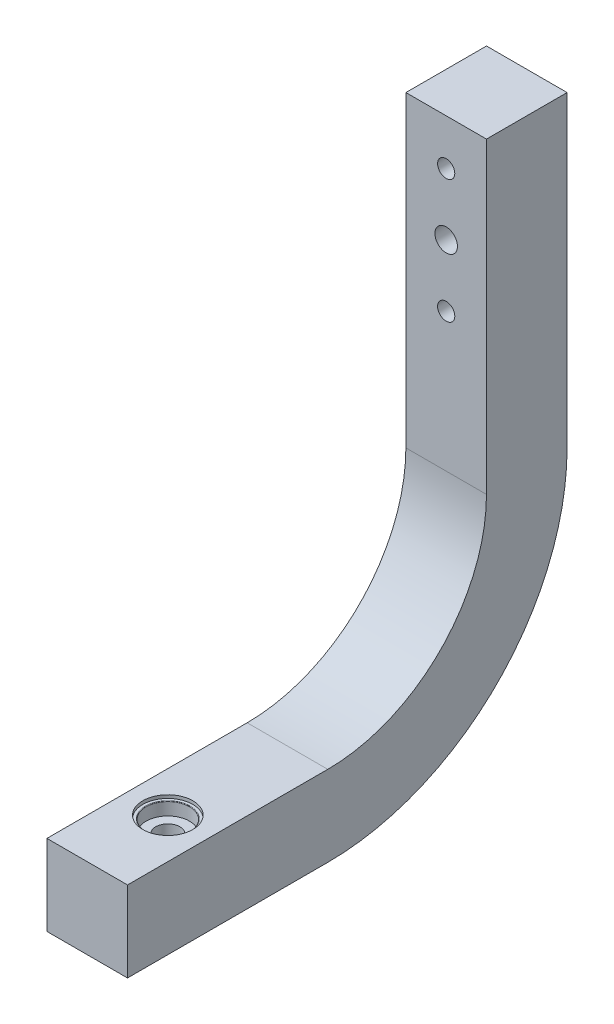
ISO-10303-21;
HEADER;
FILE_DESCRIPTION(('STEP AP214'),'2;1');
FILE_NAME('part.step','',(''),(''),'','','');
FILE_SCHEMA(('AUTOMOTIVE_DESIGN { 1 0 10303 214 1 1 1 1 }'));
ENDSEC;
DATA;
#1=APPLICATION_CONTEXT('core data for automotive mechanical design processes');
#2=APPLICATION_PROTOCOL_DEFINITION('international standard','automotive_design',2000,#1);
#3=PRODUCT_CONTEXT('',#1,'mechanical');
#4=PRODUCT('Part','Part','',(#3));
#5=PRODUCT_RELATED_PRODUCT_CATEGORY('part','',(#4));
#6=PRODUCT_DEFINITION_FORMATION('','',#4);
#7=PRODUCT_DEFINITION_CONTEXT('part definition',#1,'design');
#8=PRODUCT_DEFINITION('design','',#6,#7);
#9=PRODUCT_DEFINITION_SHAPE('','',#8);
#10=(LENGTH_UNIT() NAMED_UNIT(*) SI_UNIT(.MILLI.,.METRE.));
#11=(NAMED_UNIT(*) PLANE_ANGLE_UNIT() SI_UNIT($,.RADIAN.));
#12=(NAMED_UNIT(*) SI_UNIT($,.STERADIAN.) SOLID_ANGLE_UNIT());
#13=UNCERTAINTY_MEASURE_WITH_UNIT(LENGTH_MEASURE(1.E-05),#10,'distance_accuracy_value','');
#14=(GEOMETRIC_REPRESENTATION_CONTEXT(3) GLOBAL_UNCERTAINTY_ASSIGNED_CONTEXT((#13)) GLOBAL_UNIT_ASSIGNED_CONTEXT((#10,
#11,#12)) REPRESENTATION_CONTEXT('',''));
#15=CARTESIAN_POINT('',(0.,0.,0.));
#16=DIRECTION('',(0.,0.,1.));
#17=DIRECTION('',(1.,0.,0.));
#18=AXIS2_PLACEMENT_3D('',#15,#16,#17);
#19=CARTESIAN_POINT('',(-7.5,-37.2681938200001,15.));
#20=DIRECTION('',(0.,0.,1.));
#21=DIRECTION('',(0.,-1.,0.));
#22=AXIS2_PLACEMENT_3D('',#19,#20,#21);
#23=PLANE('',#22);
#24=CARTESIAN_POINT('',(0.,-11.5,15.));
#25=DIRECTION('',(0.,0.,1.));
#26=DIRECTION('',(0.,-1.,0.));
#27=AXIS2_PLACEMENT_3D('',#24,#25,#26);
#28=CIRCLE('',#27,1.6);
#29=CARTESIAN_POINT('',(0.,-13.1,15.));
#30=VERTEX_POINT('',#29);
#31=EDGE_CURVE('E123',#30,#30,#28,.T.);
#32=ORIENTED_EDGE('',*,*,#31,.F.);
#33=EDGE_LOOP('',(#32));
#34=FACE_BOUND('',#33,.T.);
#35=CARTESIAN_POINT('',(0.,11.5,15.));
#36=DIRECTION('',(0.,0.,1.));
#37=DIRECTION('',(0.,-1.,0.));
#38=AXIS2_PLACEMENT_3D('',#35,#36,#37);
#39=CIRCLE('',#38,1.6);
#40=CARTESIAN_POINT('',(0.,9.90000000000001,15.));
#41=VERTEX_POINT('',#40);
#42=EDGE_CURVE('E126',#41,#41,#39,.T.);
#43=ORIENTED_EDGE('',*,*,#42,.F.);
#44=EDGE_LOOP('',(#43));
#45=FACE_BOUND('',#44,.T.);
#46=CARTESIAN_POINT('',(0.,0.,15.));
#47=DIRECTION('',(0.,0.,1.));
#48=DIRECTION('',(0.,-1.,0.));
#49=AXIS2_PLACEMENT_3D('',#46,#47,#48);
#50=CIRCLE('',#49,2.1);
#51=CARTESIAN_POINT('',(0.,-2.09999999999999,15.));
#52=VERTEX_POINT('',#51);
#53=EDGE_CURVE('E209',#52,#52,#50,.T.);
#54=ORIENTED_EDGE('',*,*,#53,.F.);
#55=EDGE_LOOP('',(#54));
#56=FACE_BOUND('',#55,.T.);
#57=DIRECTION('',(1.,0.,0.));
#58=VECTOR('',#57,1.);
#59=CARTESIAN_POINT('',(-7.5,-37.26819382,15.));
#60=LINE('',#59,#58);
#61=CARTESIAN_POINT('',(-7.5,-37.26819382,15.));
#62=VERTEX_POINT('',#61);
#63=CARTESIAN_POINT('',(7.5,-37.26819382,15.));
#64=VERTEX_POINT('',#63);
#65=EDGE_CURVE('E100',#62,#64,#60,.T.);
#66=ORIENTED_EDGE('',*,*,#65,.T.);
#67=DIRECTION('',(0.,-1.,0.));
#68=VECTOR('',#67,1.);
#69=CARTESIAN_POINT('',(7.5,-37.2681938200001,15.));
#70=LINE('',#69,#68);
#71=CARTESIAN_POINT('',(7.5,20.,15.));
#72=VERTEX_POINT('',#71);
#73=EDGE_CURVE('E103',#72,#64,#70,.T.);
#74=ORIENTED_EDGE('',*,*,#73,.F.);
#75=DIRECTION('',(1.,0.,0.));
#76=VECTOR('',#75,1.);
#77=CARTESIAN_POINT('',(-7.5,20.,15.));
#78=LINE('',#77,#76);
#79=CARTESIAN_POINT('',(-7.5,20.,15.));
#80=VERTEX_POINT('',#79);
#81=EDGE_CURVE('E11',#80,#72,#78,.T.);
#82=ORIENTED_EDGE('',*,*,#81,.F.);
#83=DIRECTION('',(0.,-1.,0.));
#84=VECTOR('',#83,1.);
#85=CARTESIAN_POINT('',(-7.5,-37.2681938200001,15.));
#86=LINE('',#85,#84);
#87=EDGE_CURVE('E104',#80,#62,#86,.T.);
#88=ORIENTED_EDGE('',*,*,#87,.T.);
#89=EDGE_LOOP('',(#66,#74,#82,#88));
#90=FACE_BOUND('',#89,.T.);
#91=ADVANCED_FACE('F38',(#34,#45,#56,#90),#23,.T.);
#92=CARTESIAN_POINT('',(-7.5,20.,15.));
#93=DIRECTION('',(0.,1.,0.));
#94=DIRECTION('',(0.,0.,1.));
#95=AXIS2_PLACEMENT_3D('',#92,#93,#94);
#96=PLANE('',#95);
#97=ORIENTED_EDGE('',*,*,#81,.T.);
#98=DIRECTION('',(0.,0.,1.));
#99=VECTOR('',#98,1.);
#100=CARTESIAN_POINT('',(7.5,20.,15.));
#101=LINE('',#100,#99);
#102=CARTESIAN_POINT('',(7.5,20.,0.));
#103=VERTEX_POINT('',#102);
#104=EDGE_CURVE('E122',#103,#72,#101,.T.);
#105=ORIENTED_EDGE('',*,*,#104,.F.);
#106=DIRECTION('',(1.,0.,0.));
#107=VECTOR('',#106,1.);
#108=CARTESIAN_POINT('',(-7.5,20.,0.));
#109=LINE('',#108,#107);
#110=CARTESIAN_POINT('',(-7.5,20.,0.));
#111=VERTEX_POINT('',#110);
#112=EDGE_CURVE('E46',#111,#103,#109,.T.);
#113=ORIENTED_EDGE('',*,*,#112,.F.);
#114=DIRECTION('',(0.,0.,1.));
#115=VECTOR('',#114,1.);
#116=CARTESIAN_POINT('',(-7.5,20.,15.));
#117=LINE('',#116,#115);
#118=EDGE_CURVE('E109',#111,#80,#117,.T.);
#119=ORIENTED_EDGE('',*,*,#118,.T.);
#120=EDGE_LOOP('',(#97,#105,#113,#119));
#121=FACE_BOUND('',#120,.T.);
#122=ADVANCED_FACE('F219',(#121),#96,.T.);
#123=CARTESIAN_POINT('',(-7.5,20.,0.));
#124=DIRECTION('',(0.,0.,-1.));
#125=DIRECTION('',(0.,1.,0.));
#126=AXIS2_PLACEMENT_3D('',#123,#124,#125);
#127=PLANE('',#126);
#128=CARTESIAN_POINT('',(0.,-11.5,0.));
#129=DIRECTION('',(0.,0.,1.));
#130=DIRECTION('',(1.,0.,0.));
#131=AXIS2_PLACEMENT_3D('',#128,#129,#130);
#132=CIRCLE('',#131,1.6);
#133=CARTESIAN_POINT('',(1.6,-11.5,0.));
#134=VERTEX_POINT('',#133);
#135=EDGE_CURVE('E174',#134,#134,#132,.T.);
#136=ORIENTED_EDGE('',*,*,#135,.T.);
#137=EDGE_LOOP('',(#136));
#138=FACE_BOUND('',#137,.T.);
#139=CARTESIAN_POINT('',(0.,11.5,0.));
#140=DIRECTION('',(0.,0.,1.));
#141=DIRECTION('',(1.,0.,0.));
#142=AXIS2_PLACEMENT_3D('',#139,#140,#141);
#143=CIRCLE('',#142,1.6);
#144=CARTESIAN_POINT('',(1.6,11.5,0.));
#145=VERTEX_POINT('',#144);
#146=EDGE_CURVE('E201',#145,#145,#143,.T.);
#147=ORIENTED_EDGE('',*,*,#146,.T.);
#148=EDGE_LOOP('',(#147));
#149=FACE_BOUND('',#148,.T.);
#150=CARTESIAN_POINT('',(0.,0.,0.));
#151=DIRECTION('',(0.,0.,1.));
#152=DIRECTION('',(1.,0.,0.));
#153=AXIS2_PLACEMENT_3D('',#150,#151,#152);
#154=CIRCLE('',#153,2.1);
#155=CARTESIAN_POINT('',(2.1,0.,0.));
#156=VERTEX_POINT('',#155);
#157=EDGE_CURVE('E204',#156,#156,#154,.T.);
#158=ORIENTED_EDGE('',*,*,#157,.T.);
#159=EDGE_LOOP('',(#158));
#160=FACE_BOUND('',#159,.T.);
#161=ORIENTED_EDGE('',*,*,#112,.T.);
#162=DIRECTION('',(0.,1.,0.));
#163=VECTOR('',#162,1.);
#164=CARTESIAN_POINT('',(7.5,20.,0.));
#165=LINE('',#164,#163);
#166=CARTESIAN_POINT('',(7.5,-37.26819382,0.));
#167=VERTEX_POINT('',#166);
#168=EDGE_CURVE('E140',#167,#103,#165,.T.);
#169=ORIENTED_EDGE('',*,*,#168,.F.);
#170=DIRECTION('',(1.,0.,0.));
#171=VECTOR('',#170,1.);
#172=CARTESIAN_POINT('',(-7.5,-37.26819382,0.));
#173=LINE('',#172,#171);
#174=CARTESIAN_POINT('',(-7.5,-37.26819382,0.));
#175=VERTEX_POINT('',#174);
#176=EDGE_CURVE('E160',#175,#167,#173,.T.);
#177=ORIENTED_EDGE('',*,*,#176,.F.);
#178=DIRECTION('',(0.,1.,0.));
#179=VECTOR('',#178,1.);
#180=CARTESIAN_POINT('',(-7.5,20.,0.));
#181=LINE('',#180,#179);
#182=EDGE_CURVE('E156',#175,#111,#181,.T.);
#183=ORIENTED_EDGE('',*,*,#182,.T.);
#184=EDGE_LOOP('',(#161,#169,#177,#183));
#185=FACE_BOUND('',#184,.T.);
#186=ADVANCED_FACE('F229',(#138,#149,#160,#185),#127,.T.);
#187=CARTESIAN_POINT('',(-7.5,-37.26819382,44.53638764));
#188=DIRECTION('',(1.,0.,0.));
#189=DIRECTION('',(0.,0.,-1.));
#190=AXIS2_PLACEMENT_3D('',#187,#188,#189);
#191=CYLINDRICAL_SURFACE('',#190,44.53638764);
#192=ORIENTED_EDGE('',*,*,#176,.T.);
#193=CARTESIAN_POINT('',(7.5,-37.26819382,44.53638764));
#194=DIRECTION('',(1.,0.,0.));
#195=DIRECTION('',(0.,0.,-1.));
#196=AXIS2_PLACEMENT_3D('',#193,#194,#195);
#197=CIRCLE('',#196,44.53638764);
#198=CARTESIAN_POINT('',(7.5,-81.80458146,44.53638764));
#199=VERTEX_POINT('',#198);
#200=EDGE_CURVE('E137',#199,#167,#197,.T.);
#201=ORIENTED_EDGE('',*,*,#200,.F.);
#202=DIRECTION('',(1.,0.,0.));
#203=VECTOR('',#202,1.);
#204=CARTESIAN_POINT('',(-7.5,-81.80458146,44.53638764));
#205=LINE('',#204,#203);
#206=CARTESIAN_POINT('',(-7.5,-81.80458146,44.53638764));
#207=VERTEX_POINT('',#206);
#208=EDGE_CURVE('E162',#207,#199,#205,.T.);
#209=ORIENTED_EDGE('',*,*,#208,.F.);
#210=CARTESIAN_POINT('',(-7.5,-37.26819382,44.53638764));
#211=DIRECTION('',(1.,0.,0.));
#212=DIRECTION('',(0.,0.,-1.));
#213=AXIS2_PLACEMENT_3D('',#210,#211,#212);
#214=CIRCLE('',#213,44.53638764);
#215=EDGE_CURVE('E153',#207,#175,#214,.T.);
#216=ORIENTED_EDGE('',*,*,#215,.T.);
#217=EDGE_LOOP('',(#192,#201,#209,#216));
#218=FACE_BOUND('',#217,.T.);
#219=ADVANCED_FACE('F232',(#218),#191,.T.);
#220=CARTESIAN_POINT('',(-7.5,-81.80458146,44.53638764));
#221=DIRECTION('',(0.,-1.,0.));
#222=DIRECTION('',(0.,0.,-1.));
#223=AXIS2_PLACEMENT_3D('',#220,#221,#222);
#224=PLANE('',#223);
#225=CARTESIAN_POINT('',(0.,-81.80458146,66.80458146));
#226=DIRECTION('',(0.,-1.,0.));
#227=DIRECTION('',(0.,0.,-1.));
#228=AXIS2_PLACEMENT_3D('',#225,#226,#227);
#229=CIRCLE('',#228,4.65);
#230=CARTESIAN_POINT('',(0.,-81.80458146,62.15458146));
#231=VERTEX_POINT('',#230);
#232=EDGE_CURVE('E200',#231,#231,#229,.T.);
#233=ORIENTED_EDGE('',*,*,#232,.F.);
#234=EDGE_LOOP('',(#233));
#235=FACE_BOUND('',#234,.T.);
#236=ORIENTED_EDGE('',*,*,#208,.T.);
#237=DIRECTION('',(0.,0.,-1.));
#238=VECTOR('',#237,1.);
#239=CARTESIAN_POINT('',(7.5,-81.80458146,66.80458146));
#240=LINE('',#239,#238);
#241=CARTESIAN_POINT('',(7.5,-81.80458146,81.80458146));
#242=VERTEX_POINT('',#241);
#243=EDGE_CURVE('E134',#242,#199,#240,.T.);
#244=ORIENTED_EDGE('',*,*,#243,.F.);
#245=DIRECTION('',(1.,0.,0.));
#246=VECTOR('',#245,1.);
#247=CARTESIAN_POINT('',(-7.5,-81.80458146,81.80458146));
#248=LINE('',#247,#246);
#249=CARTESIAN_POINT('',(-7.5,-81.80458146,81.80458146));
#250=VERTEX_POINT('',#249);
#251=EDGE_CURVE('E164',#250,#242,#248,.T.);
#252=ORIENTED_EDGE('',*,*,#251,.F.);
#253=DIRECTION('',(0.,0.,-1.));
#254=VECTOR('',#253,1.);
#255=CARTESIAN_POINT('',(-7.5,-81.80458146,66.80458146));
#256=LINE('',#255,#254);
#257=EDGE_CURVE('E151',#250,#207,#256,.T.);
#258=ORIENTED_EDGE('',*,*,#257,.T.);
#259=EDGE_LOOP('',(#236,#244,#252,#258));
#260=FACE_BOUND('',#259,.T.);
#261=ADVANCED_FACE('F253',(#235,#260),#224,.T.);
#262=CARTESIAN_POINT('',(-7.5,-66.80458146,81.80458146));
#263=DIRECTION('',(0.,0.,1.));
#264=DIRECTION('',(1.,0.,0.));
#265=AXIS2_PLACEMENT_3D('',#262,#263,#264);
#266=PLANE('',#265);
#267=ORIENTED_EDGE('',*,*,#251,.T.);
#268=DIRECTION('',(0.,-1.,0.));
#269=VECTOR('',#268,1.);
#270=CARTESIAN_POINT('',(7.5,-66.80458146,81.80458146));
#271=LINE('',#270,#269);
#272=CARTESIAN_POINT('',(7.5,-66.80458146,81.80458146));
#273=VERTEX_POINT('',#272);
#274=EDGE_CURVE('E131',#273,#242,#271,.T.);
#275=ORIENTED_EDGE('',*,*,#274,.F.);
#276=DIRECTION('',(1.,0.,0.));
#277=VECTOR('',#276,1.);
#278=CARTESIAN_POINT('',(-7.5,-66.80458146,81.80458146));
#279=LINE('',#278,#277);
#280=CARTESIAN_POINT('',(-7.5,-66.80458146,81.80458146));
#281=VERTEX_POINT('',#280);
#282=EDGE_CURVE('E166',#281,#273,#279,.T.);
#283=ORIENTED_EDGE('',*,*,#282,.F.);
#284=DIRECTION('',(0.,-1.,0.));
#285=VECTOR('',#284,1.);
#286=CARTESIAN_POINT('',(-7.5,-66.80458146,81.80458146));
#287=LINE('',#286,#285);
#288=EDGE_CURVE('E148',#281,#250,#287,.T.);
#289=ORIENTED_EDGE('',*,*,#288,.T.);
#290=EDGE_LOOP('',(#267,#275,#283,#289));
#291=FACE_BOUND('',#290,.T.);
#292=ADVANCED_FACE('F250',(#291),#266,.T.);
#293=CARTESIAN_POINT('',(-7.5,-66.80458146,66.80458146));
#294=DIRECTION('',(0.,1.,0.));
#295=DIRECTION('',(0.,0.,1.));
#296=AXIS2_PLACEMENT_3D('',#293,#294,#295);
#297=PLANE('',#296);
#298=CARTESIAN_POINT('',(0.,-66.80458146,66.80458146));
#299=DIRECTION('',(0.,-1.,0.));
#300=DIRECTION('',(0.,0.,-1.));
#301=AXIS2_PLACEMENT_3D('',#298,#299,#300);
#302=CIRCLE('',#301,4.65);
#303=CARTESIAN_POINT('',(0.,-66.80458146,62.15458146));
#304=VERTEX_POINT('',#303);
#305=EDGE_CURVE('E197',#304,#304,#302,.T.);
#306=ORIENTED_EDGE('',*,*,#305,.T.);
#307=EDGE_LOOP('',(#306));
#308=FACE_BOUND('',#307,.T.);
#309=ORIENTED_EDGE('',*,*,#282,.T.);
#310=DIRECTION('',(0.,0.,1.));
#311=VECTOR('',#310,1.);
#312=CARTESIAN_POINT('',(7.5,-66.80458146,66.80458146));
#313=LINE('',#312,#311);
#314=CARTESIAN_POINT('',(7.5,-66.80458146,44.53638764));
#315=VERTEX_POINT('',#314);
#316=EDGE_CURVE('E117',#315,#273,#313,.T.);
#317=ORIENTED_EDGE('',*,*,#316,.F.);
#318=DIRECTION('',(1.,0.,0.));
#319=VECTOR('',#318,1.);
#320=CARTESIAN_POINT('',(-7.5,-66.80458146,44.53638764));
#321=LINE('',#320,#319);
#322=CARTESIAN_POINT('',(-7.5,-66.80458146,44.53638764));
#323=VERTEX_POINT('',#322);
#324=EDGE_CURVE('E108',#323,#315,#321,.T.);
#325=ORIENTED_EDGE('',*,*,#324,.F.);
#326=DIRECTION('',(0.,0.,1.));
#327=VECTOR('',#326,1.);
#328=CARTESIAN_POINT('',(-7.5,-66.80458146,66.80458146));
#329=LINE('',#328,#327);
#330=EDGE_CURVE('E146',#323,#281,#329,.T.);
#331=ORIENTED_EDGE('',*,*,#330,.T.);
#332=EDGE_LOOP('',(#309,#317,#325,#331));
#333=FACE_BOUND('',#332,.T.);
#334=ADVANCED_FACE('F247',(#308,#333),#297,.T.);
#335=CARTESIAN_POINT('',(-7.5,-37.26819382,44.53638764));
#336=DIRECTION('',(1.,0.,0.));
#337=DIRECTION('',(0.,0.,-1.));
#338=AXIS2_PLACEMENT_3D('',#335,#336,#337);
#339=CYLINDRICAL_SURFACE('',#338,29.53638764);
#340=ORIENTED_EDGE('',*,*,#324,.T.);
#341=CARTESIAN_POINT('',(7.5,-37.26819382,44.53638764));
#342=DIRECTION('',(-1.,0.,0.));
#343=DIRECTION('',(0.,0.,-1.));
#344=AXIS2_PLACEMENT_3D('',#341,#342,#343);
#345=CIRCLE('',#344,29.53638764);
#346=EDGE_CURVE('E112',#64,#315,#345,.T.);
#347=ORIENTED_EDGE('',*,*,#346,.F.);
#348=ORIENTED_EDGE('',*,*,#65,.F.);
#349=CARTESIAN_POINT('',(-7.5,-37.26819382,44.53638764));
#350=DIRECTION('',(-1.,0.,0.));
#351=DIRECTION('',(0.,0.,-1.));
#352=AXIS2_PLACEMENT_3D('',#349,#350,#351);
#353=CIRCLE('',#352,29.53638764);
#354=EDGE_CURVE('E144',#62,#323,#353,.T.);
#355=ORIENTED_EDGE('',*,*,#354,.T.);
#356=EDGE_LOOP('',(#340,#347,#348,#355));
#357=FACE_BOUND('',#356,.T.);
#358=ADVANCED_FACE('F113',(#357),#339,.F.);
#359=CARTESIAN_POINT('',(-7.5,-37.26819382,44.53638764));
#360=DIRECTION('',(1.,0.,0.));
#361=DIRECTION('',(0.,0.,-1.));
#362=AXIS2_PLACEMENT_3D('',#359,#360,#361);
#363=PLANE('',#362);
#364=ORIENTED_EDGE('',*,*,#87,.F.);
#365=ORIENTED_EDGE('',*,*,#118,.F.);
#366=ORIENTED_EDGE('',*,*,#182,.F.);
#367=ORIENTED_EDGE('',*,*,#215,.F.);
#368=ORIENTED_EDGE('',*,*,#257,.F.);
#369=ORIENTED_EDGE('',*,*,#288,.F.);
#370=ORIENTED_EDGE('',*,*,#330,.F.);
#371=ORIENTED_EDGE('',*,*,#354,.F.);
#372=EDGE_LOOP('',(#364,#365,#366,#367,#368,#369,#370,#371));
#373=FACE_BOUND('',#372,.T.);
#374=ADVANCED_FACE('F240',(#373),#363,.F.);
#375=CARTESIAN_POINT('',(7.5,-37.26819382,44.53638764));
#376=DIRECTION('',(1.,0.,0.));
#377=DIRECTION('',(0.,0.,-1.));
#378=AXIS2_PLACEMENT_3D('',#375,#376,#377);
#379=PLANE('',#378);
#380=ORIENTED_EDGE('',*,*,#73,.T.);
#381=ORIENTED_EDGE('',*,*,#346,.T.);
#382=ORIENTED_EDGE('',*,*,#316,.T.);
#383=ORIENTED_EDGE('',*,*,#274,.T.);
#384=ORIENTED_EDGE('',*,*,#243,.T.);
#385=ORIENTED_EDGE('',*,*,#200,.T.);
#386=ORIENTED_EDGE('',*,*,#168,.T.);
#387=ORIENTED_EDGE('',*,*,#104,.T.);
#388=EDGE_LOOP('',(#380,#381,#382,#383,#384,#385,#386,#387));
#389=FACE_BOUND('',#388,.T.);
#390=ADVANCED_FACE('F120',(#389),#379,.T.);
#391=CARTESIAN_POINT('',(0.,0.,0.));
#392=DIRECTION('',(0.,0.,1.));
#393=DIRECTION('',(1.,0.,0.));
#394=AXIS2_PLACEMENT_3D('',#391,#392,#393);
#395=CYLINDRICAL_SURFACE('',#394,2.1);
#396=ORIENTED_EDGE('',*,*,#53,.T.);
#397=EDGE_LOOP('',(#396));
#398=FACE_BOUND('',#397,.T.);
#399=ORIENTED_EDGE('',*,*,#157,.F.);
#400=EDGE_LOOP('',(#399));
#401=FACE_BOUND('',#400,.T.);
#402=ADVANCED_FACE('F223',(#398,#401),#395,.F.);
#403=CARTESIAN_POINT('',(0.,11.5,0.));
#404=DIRECTION('',(0.,0.,1.));
#405=DIRECTION('',(1.,0.,0.));
#406=AXIS2_PLACEMENT_3D('',#403,#404,#405);
#407=CYLINDRICAL_SURFACE('',#406,1.6);
#408=ORIENTED_EDGE('',*,*,#42,.T.);
#409=EDGE_LOOP('',(#408));
#410=FACE_BOUND('',#409,.T.);
#411=ORIENTED_EDGE('',*,*,#146,.F.);
#412=EDGE_LOOP('',(#411));
#413=FACE_BOUND('',#412,.T.);
#414=ADVANCED_FACE('F214',(#410,#413),#407,.F.);
#415=CARTESIAN_POINT('',(0.,-11.5,0.));
#416=DIRECTION('',(0.,0.,1.));
#417=DIRECTION('',(1.,0.,0.));
#418=AXIS2_PLACEMENT_3D('',#415,#416,#417);
#419=CYLINDRICAL_SURFACE('',#418,1.6);
#420=ORIENTED_EDGE('',*,*,#31,.T.);
#421=EDGE_LOOP('',(#420));
#422=FACE_BOUND('',#421,.T.);
#423=ORIENTED_EDGE('',*,*,#135,.F.);
#424=EDGE_LOOP('',(#423));
#425=FACE_BOUND('',#424,.T.);
#426=ADVANCED_FACE('F363',(#422,#425),#419,.F.);
#427=CARTESIAN_POINT('',(0.,-69.80458146,66.80458146));
#428=DIRECTION('',(0.,-1.,0.));
#429=DIRECTION('',(0.,0.,-1.));
#430=AXIS2_PLACEMENT_3D('',#427,#428,#429);
#431=PLANE('',#430);
#432=CARTESIAN_POINT('',(0.,-69.80458146,66.80458146));
#433=DIRECTION('',(0.,-1.,0.));
#434=DIRECTION('',(0.,0.,-1.));
#435=AXIS2_PLACEMENT_3D('',#432,#433,#434);
#436=CIRCLE('',#435,4.05);
#437=CARTESIAN_POINT('',(0.,-69.80458146,62.75458146));
#438=VERTEX_POINT('',#437);
#439=EDGE_CURVE('E185',#438,#438,#436,.T.);
#440=ORIENTED_EDGE('',*,*,#439,.F.);
#441=EDGE_LOOP('',(#440));
#442=FACE_BOUND('',#441,.T.);
#443=CARTESIAN_POINT('',(0.,-69.80458146,66.80458146));
#444=DIRECTION('',(0.,-1.,0.));
#445=DIRECTION('',(0.,0.,-1.));
#446=AXIS2_PLACEMENT_3D('',#443,#444,#445);
#447=CIRCLE('',#446,2.25);
#448=CARTESIAN_POINT('',(0.,-69.80458146,64.55458146));
#449=VERTEX_POINT('',#448);
#450=EDGE_CURVE('E168',#449,#449,#447,.F.);
#451=ORIENTED_EDGE('',*,*,#450,.F.);
#452=EDGE_LOOP('',(#451));
#453=FACE_BOUND('',#452,.T.);
#454=ADVANCED_FACE('F371',(#442,#453),#431,.F.);
#455=CARTESIAN_POINT('',(0.,-52.1687357711849,66.80458146));
#456=DIRECTION('',(0.,-1.,0.));
#457=DIRECTION('',(0.,0.,-1.));
#458=AXIS2_PLACEMENT_3D('',#455,#456,#457);
#459=CYLINDRICAL_SURFACE('',#458,4.65);
#460=ORIENTED_EDGE('',*,*,#305,.F.);
#461=EDGE_LOOP('',(#460));
#462=FACE_BOUND('',#461,.T.);
#463=CARTESIAN_POINT('',(0.,-67.40458146,66.80458146));
#464=DIRECTION('',(0.,-1.,0.));
#465=DIRECTION('',(0.,0.,-1.));
#466=AXIS2_PLACEMENT_3D('',#463,#464,#465);
#467=CIRCLE('',#466,4.65);
#468=CARTESIAN_POINT('',(0.,-67.40458146,62.15458146));
#469=VERTEX_POINT('',#468);
#470=EDGE_CURVE('E194',#469,#469,#467,.T.);
#471=ORIENTED_EDGE('',*,*,#470,.T.);
#472=EDGE_LOOP('',(#471));
#473=FACE_BOUND('',#472,.T.);
#474=ADVANCED_FACE('F380',(#462,#473),#459,.F.);
#475=CARTESIAN_POINT('',(0.,-67.40458146,62.65458146));
#476=DIRECTION('',(0.,-1.,0.));
#477=DIRECTION('',(0.,0.,-1.));
#478=AXIS2_PLACEMENT_3D('',#475,#476,#477);
#479=PLANE('',#478);
#480=ORIENTED_EDGE('',*,*,#470,.F.);
#481=EDGE_LOOP('',(#480));
#482=FACE_BOUND('',#481,.T.);
#483=CARTESIAN_POINT('',(0.,-67.40458146,66.80458146));
#484=DIRECTION('',(0.,-1.,0.));
#485=DIRECTION('',(0.,0.,-1.));
#486=AXIS2_PLACEMENT_3D('',#483,#484,#485);
#487=CIRCLE('',#486,4.15);
#488=CARTESIAN_POINT('',(0.,-67.40458146,62.65458146));
#489=VERTEX_POINT('',#488);
#490=EDGE_CURVE('E191',#489,#489,#487,.T.);
#491=ORIENTED_EDGE('',*,*,#490,.T.);
#492=EDGE_LOOP('',(#491));
#493=FACE_BOUND('',#492,.T.);
#494=ADVANCED_FACE('F390',(#482,#493),#479,.F.);
#495=CARTESIAN_POINT('',(0.,-67.50458146,66.80458146));
#496=DIRECTION('',(0.,-1.,0.));
#497=DIRECTION('',(0.,0.,-1.));
#498=AXIS2_PLACEMENT_3D('',#495,#496,#497);
#499=TOROIDAL_SURFACE('',#498,4.15,0.100000000000003);
#500=ORIENTED_EDGE('',*,*,#490,.F.);
#501=EDGE_LOOP('',(#500));
#502=FACE_BOUND('',#501,.T.);
#503=CARTESIAN_POINT('',(0.,-67.50458146,66.80458146));
#504=DIRECTION('',(0.,-1.,0.));
#505=DIRECTION('',(0.,0.,-1.));
#506=AXIS2_PLACEMENT_3D('',#503,#504,#505);
#507=CIRCLE('',#506,4.05);
#508=CARTESIAN_POINT('',(0.,-67.50458146,62.75458146));
#509=VERTEX_POINT('',#508);
#510=EDGE_CURVE('E188',#509,#509,#507,.T.);
#511=ORIENTED_EDGE('',*,*,#510,.T.);
#512=EDGE_LOOP('',(#511));
#513=FACE_BOUND('',#512,.T.);
#514=ADVANCED_FACE('F400',(#502,#513),#499,.T.);
#515=CARTESIAN_POINT('',(0.,-52.1687357711849,66.80458146));
#516=DIRECTION('',(0.,-1.,0.));
#517=DIRECTION('',(0.,0.,-1.));
#518=AXIS2_PLACEMENT_3D('',#515,#516,#517);
#519=CYLINDRICAL_SURFACE('',#518,4.05);
#520=ORIENTED_EDGE('',*,*,#510,.F.);
#521=EDGE_LOOP('',(#520));
#522=FACE_BOUND('',#521,.T.);
#523=ORIENTED_EDGE('',*,*,#439,.T.);
#524=EDGE_LOOP('',(#523));
#525=FACE_BOUND('',#524,.T.);
#526=ADVANCED_FACE('F410',(#522,#525),#519,.F.);
#527=CARTESIAN_POINT('',(0.,-78.80458146,66.80458146));
#528=DIRECTION('',(0.,1.,0.));
#529=DIRECTION('',(0.,0.,1.));
#530=AXIS2_PLACEMENT_3D('',#527,#528,#529);
#531=PLANE('',#530);
#532=CARTESIAN_POINT('',(0.,-78.80458146,66.80458146));
#533=DIRECTION('',(0.,-1.,0.));
#534=DIRECTION('',(0.,0.,-1.));
#535=AXIS2_PLACEMENT_3D('',#532,#533,#534);
#536=CIRCLE('',#535,4.05);
#537=CARTESIAN_POINT('',(0.,-78.80458146,62.75458146));
#538=VERTEX_POINT('',#537);
#539=EDGE_CURVE('E170',#538,#538,#536,.T.);
#540=ORIENTED_EDGE('',*,*,#539,.T.);
#541=EDGE_LOOP('',(#540));
#542=FACE_BOUND('',#541,.T.);
#543=CARTESIAN_POINT('',(0.,-78.80458146,66.80458146));
#544=DIRECTION('',(0.,1.,0.));
#545=DIRECTION('',(0.,0.,1.));
#546=AXIS2_PLACEMENT_3D('',#543,#544,#545);
#547=CIRCLE('',#546,2.25);
#548=CARTESIAN_POINT('',(0.,-78.80458146,69.05458146));
#549=VERTEX_POINT('',#548);
#550=EDGE_CURVE('E41',#549,#549,#547,.F.);
#551=ORIENTED_EDGE('',*,*,#550,.F.);
#552=EDGE_LOOP('',(#551));
#553=FACE_BOUND('',#552,.T.);
#554=ADVANCED_FACE('F420',(#542,#553),#531,.F.);
#555=CARTESIAN_POINT('',(0.,-52.1687357711849,66.80458146));
#556=DIRECTION('',(0.,-1.,0.));
#557=DIRECTION('',(0.,0.,-1.));
#558=AXIS2_PLACEMENT_3D('',#555,#556,#557);
#559=CYLINDRICAL_SURFACE('',#558,4.05);
#560=ORIENTED_EDGE('',*,*,#539,.F.);
#561=EDGE_LOOP('',(#560));
#562=FACE_BOUND('',#561,.T.);
#563=CARTESIAN_POINT('',(0.,-81.10458146,66.80458146));
#564=DIRECTION('',(0.,-1.,0.));
#565=DIRECTION('',(0.,0.,-1.));
#566=AXIS2_PLACEMENT_3D('',#563,#564,#565);
#567=CIRCLE('',#566,4.05);
#568=CARTESIAN_POINT('',(0.,-81.10458146,62.75458146));
#569=VERTEX_POINT('',#568);
#570=EDGE_CURVE('E176',#569,#569,#567,.T.);
#571=ORIENTED_EDGE('',*,*,#570,.T.);
#572=EDGE_LOOP('',(#571));
#573=FACE_BOUND('',#572,.T.);
#574=ADVANCED_FACE('F430',(#562,#573),#559,.F.);
#575=CARTESIAN_POINT('',(0.,-81.10458146,66.80458146));
#576=DIRECTION('',(0.,-1.,0.));
#577=DIRECTION('',(0.,0.,-1.));
#578=AXIS2_PLACEMENT_3D('',#575,#576,#577);
#579=TOROIDAL_SURFACE('',#578,4.15,0.100000000000003);
#580=ORIENTED_EDGE('',*,*,#570,.F.);
#581=EDGE_LOOP('',(#580));
#582=FACE_BOUND('',#581,.T.);
#583=CARTESIAN_POINT('',(0.,-81.20458146,66.80458146));
#584=DIRECTION('',(0.,-1.,0.));
#585=DIRECTION('',(0.,0.,-1.));
#586=AXIS2_PLACEMENT_3D('',#583,#584,#585);
#587=CIRCLE('',#586,4.15);
#588=CARTESIAN_POINT('',(0.,-81.20458146,62.65458146));
#589=VERTEX_POINT('',#588);
#590=EDGE_CURVE('E181',#589,#589,#587,.T.);
#591=ORIENTED_EDGE('',*,*,#590,.T.);
#592=EDGE_LOOP('',(#591));
#593=FACE_BOUND('',#592,.T.);
#594=ADVANCED_FACE('F439',(#582,#593),#579,.T.);
#595=CARTESIAN_POINT('',(0.,-81.20458146,62.65458146));
#596=DIRECTION('',(0.,1.,0.));
#597=DIRECTION('',(0.,0.,1.));
#598=AXIS2_PLACEMENT_3D('',#595,#596,#597);
#599=PLANE('',#598);
#600=ORIENTED_EDGE('',*,*,#590,.F.);
#601=EDGE_LOOP('',(#600));
#602=FACE_BOUND('',#601,.T.);
#603=CARTESIAN_POINT('',(0.,-81.20458146,66.80458146));
#604=DIRECTION('',(0.,-1.,0.));
#605=DIRECTION('',(0.,0.,-1.));
#606=AXIS2_PLACEMENT_3D('',#603,#604,#605);
#607=CIRCLE('',#606,4.65);
#608=CARTESIAN_POINT('',(0.,-81.20458146,62.15458146));
#609=VERTEX_POINT('',#608);
#610=EDGE_CURVE('E473',#609,#609,#607,.T.);
#611=ORIENTED_EDGE('',*,*,#610,.T.);
#612=EDGE_LOOP('',(#611));
#613=FACE_BOUND('',#612,.T.);
#614=ADVANCED_FACE('F449',(#602,#613),#599,.F.);
#615=CARTESIAN_POINT('',(0.,-52.1687357711849,66.80458146));
#616=DIRECTION('',(0.,-1.,0.));
#617=DIRECTION('',(0.,0.,-1.));
#618=AXIS2_PLACEMENT_3D('',#615,#616,#617);
#619=CYLINDRICAL_SURFACE('',#618,4.65);
#620=ORIENTED_EDGE('',*,*,#610,.F.);
#621=EDGE_LOOP('',(#620));
#622=FACE_BOUND('',#621,.T.);
#623=ORIENTED_EDGE('',*,*,#232,.T.);
#624=EDGE_LOOP('',(#623));
#625=FACE_BOUND('',#624,.T.);
#626=ADVANCED_FACE('F347',(#622,#625),#619,.F.);
#627=CARTESIAN_POINT('',(0.,-81.80458146,66.80458146));
#628=DIRECTION('',(0.,1.,0.));
#629=DIRECTION('',(0.,0.,1.));
#630=AXIS2_PLACEMENT_3D('',#627,#628,#629);
#631=CYLINDRICAL_SURFACE('',#630,2.25);
#632=ORIENTED_EDGE('',*,*,#550,.T.);
#633=EDGE_LOOP('',(#632));
#634=FACE_BOUND('',#633,.T.);
#635=ORIENTED_EDGE('',*,*,#450,.T.);
#636=EDGE_LOOP('',(#635));
#637=FACE_BOUND('',#636,.T.);
#638=ADVANCED_FACE('F342',(#634,#637),#631,.F.);
#639=CLOSED_SHELL('',(#91,#122,#186,#219,#261,#292,#334,#358,#374,#390,#402,#414,#426,#454,#474,
#494,#514,#526,#554,#574,#594,#614,#626,#638));
#640=MANIFOLD_SOLID_BREP('B2',#639);
#641=ADVANCED_BREP_SHAPE_REPRESENTATION('',(#18,#640),#14);
#642=SHAPE_DEFINITION_REPRESENTATION(#9,#641);
ENDSEC;
END-ISO-10303-21;
